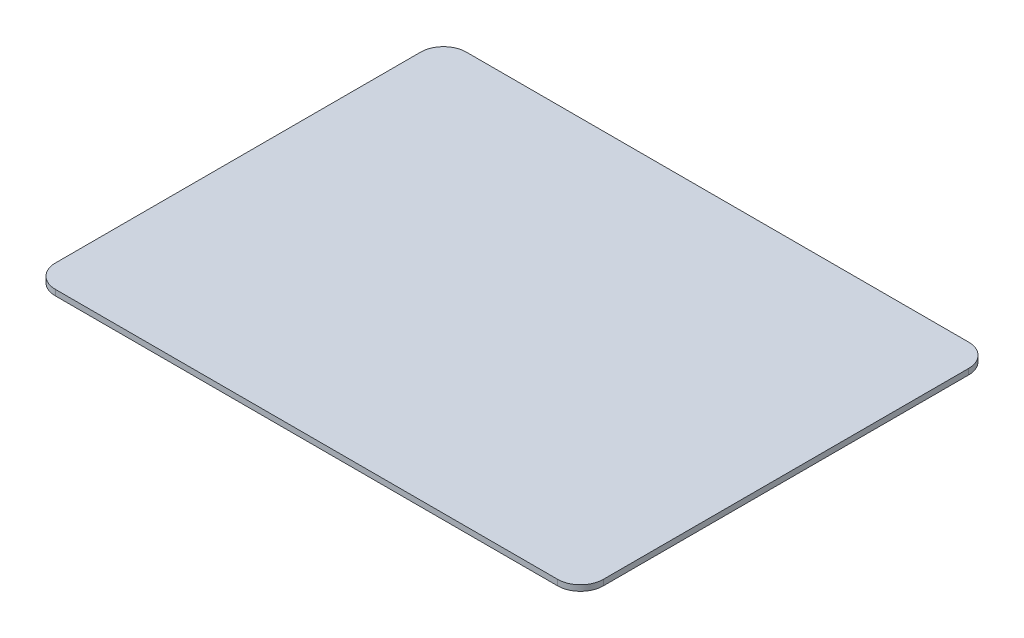
ISO-10303-21;
HEADER;
FILE_DESCRIPTION(('STEP AP214'),'2;1');
FILE_NAME('part.step','',(''),(''),'','','');
FILE_SCHEMA(('AUTOMOTIVE_DESIGN { 1 0 10303 214 1 1 1 1 }'));
ENDSEC;
DATA;
#1=APPLICATION_CONTEXT('core data for automotive mechanical design processes');
#2=APPLICATION_PROTOCOL_DEFINITION('international standard','automotive_design',2000,#1);
#3=PRODUCT_CONTEXT('',#1,'mechanical');
#4=PRODUCT('Part','Part','',(#3));
#5=PRODUCT_RELATED_PRODUCT_CATEGORY('part','',(#4));
#6=PRODUCT_DEFINITION_FORMATION('','',#4);
#7=PRODUCT_DEFINITION_CONTEXT('part definition',#1,'design');
#8=PRODUCT_DEFINITION('design','',#6,#7);
#9=PRODUCT_DEFINITION_SHAPE('','',#8);
#10=(LENGTH_UNIT() NAMED_UNIT(*) SI_UNIT(.MILLI.,.METRE.));
#11=(NAMED_UNIT(*) PLANE_ANGLE_UNIT() SI_UNIT($,.RADIAN.));
#12=(NAMED_UNIT(*) SI_UNIT($,.STERADIAN.) SOLID_ANGLE_UNIT());
#13=UNCERTAINTY_MEASURE_WITH_UNIT(LENGTH_MEASURE(1.E-05),#10,'distance_accuracy_value','');
#14=(GEOMETRIC_REPRESENTATION_CONTEXT(3) GLOBAL_UNCERTAINTY_ASSIGNED_CONTEXT((#13)) GLOBAL_UNIT_ASSIGNED_CONTEXT((#10,
#11,#12)) REPRESENTATION_CONTEXT('',''));
#15=CARTESIAN_POINT('',(0.,0.,0.));
#16=DIRECTION('',(0.,0.,1.));
#17=DIRECTION('',(1.,0.,0.));
#18=AXIS2_PLACEMENT_3D('',#15,#16,#17);
#19=CARTESIAN_POINT('',(139.7,3.175,-101.6));
#20=DIRECTION('',(0.,-1.,0.));
#21=DIRECTION('',(0.,0.,-1.));
#22=AXIS2_PLACEMENT_3D('',#19,#20,#21);
#23=CYLINDRICAL_SURFACE('',#22,12.7);
#24=CARTESIAN_POINT('',(139.7,0.,-101.6));
#25=DIRECTION('',(0.,1.,0.));
#26=DIRECTION('',(0.,0.,1.));
#27=AXIS2_PLACEMENT_3D('',#24,#25,#26);
#28=CIRCLE('',#27,12.7);
#29=CARTESIAN_POINT('',(152.4,0.,-101.6));
#30=VERTEX_POINT('',#29);
#31=CARTESIAN_POINT('',(139.7,0.,-114.3));
#32=VERTEX_POINT('',#31);
#33=EDGE_CURVE('E199',#30,#32,#28,.T.);
#34=ORIENTED_EDGE('',*,*,#33,.T.);
#35=DIRECTION('',(0.,-1.,0.));
#36=VECTOR('',#35,1.);
#37=CARTESIAN_POINT('',(139.7,3.175,-114.3));
#38=LINE('',#37,#36);
#39=CARTESIAN_POINT('',(139.7,3.175,-114.3));
#40=VERTEX_POINT('',#39);
#41=EDGE_CURVE('E12',#40,#32,#38,.T.);
#42=ORIENTED_EDGE('',*,*,#41,.F.);
#43=CARTESIAN_POINT('',(139.7,3.175,-101.6));
#44=DIRECTION('',(0.,1.,0.));
#45=DIRECTION('',(0.,0.,1.));
#46=AXIS2_PLACEMENT_3D('',#43,#44,#45);
#47=CIRCLE('',#46,12.7);
#48=CARTESIAN_POINT('',(152.4,3.175,-101.6));
#49=VERTEX_POINT('',#48);
#50=EDGE_CURVE('E164',#49,#40,#47,.T.);
#51=ORIENTED_EDGE('',*,*,#50,.F.);
#52=DIRECTION('',(0.,-1.,0.));
#53=VECTOR('',#52,1.);
#54=CARTESIAN_POINT('',(152.4,3.175,-101.6));
#55=LINE('',#54,#53);
#56=EDGE_CURVE('E139',#49,#30,#55,.T.);
#57=ORIENTED_EDGE('',*,*,#56,.T.);
#58=EDGE_LOOP('',(#34,#42,#51,#57));
#59=FACE_BOUND('',#58,.T.);
#60=ADVANCED_FACE('F44',(#59),#23,.T.);
#61=CARTESIAN_POINT('',(-139.7,3.175,-114.3));
#62=DIRECTION('',(0.,0.,1.));
#63=DIRECTION('',(1.,0.,0.));
#64=AXIS2_PLACEMENT_3D('',#61,#62,#63);
#65=PLANE('',#64);
#66=DIRECTION('',(-1.,0.,0.));
#67=VECTOR('',#66,1.);
#68=CARTESIAN_POINT('',(-139.7,0.,-114.3));
#69=LINE('',#68,#67);
#70=CARTESIAN_POINT('',(-139.7,0.,-114.3));
#71=VERTEX_POINT('',#70);
#72=EDGE_CURVE('E193',#32,#71,#69,.T.);
#73=ORIENTED_EDGE('',*,*,#72,.T.);
#74=DIRECTION('',(0.,-1.,0.));
#75=VECTOR('',#74,1.);
#76=CARTESIAN_POINT('',(-139.7,3.175,-114.3));
#77=LINE('',#76,#75);
#78=CARTESIAN_POINT('',(-139.7,3.175,-114.3));
#79=VERTEX_POINT('',#78);
#80=EDGE_CURVE('E52',#79,#71,#77,.T.);
#81=ORIENTED_EDGE('',*,*,#80,.F.);
#82=DIRECTION('',(-1.,0.,0.));
#83=VECTOR('',#82,1.);
#84=CARTESIAN_POINT('',(-139.7,3.175,-114.3));
#85=LINE('',#84,#83);
#86=EDGE_CURVE('E103',#40,#79,#85,.T.);
#87=ORIENTED_EDGE('',*,*,#86,.F.);
#88=ORIENTED_EDGE('',*,*,#41,.T.);
#89=EDGE_LOOP('',(#73,#81,#87,#88));
#90=FACE_BOUND('',#89,.T.);
#91=ADVANCED_FACE('F219',(#90),#65,.F.);
#92=CARTESIAN_POINT('',(-139.7,3.175,-101.6));
#93=DIRECTION('',(0.,-1.,0.));
#94=DIRECTION('',(0.,0.,-1.));
#95=AXIS2_PLACEMENT_3D('',#92,#93,#94);
#96=CYLINDRICAL_SURFACE('',#95,12.7);
#97=CARTESIAN_POINT('',(-139.7,0.,-101.6));
#98=DIRECTION('',(0.,1.,0.));
#99=DIRECTION('',(0.,0.,-1.));
#100=AXIS2_PLACEMENT_3D('',#97,#98,#99);
#101=CIRCLE('',#100,12.7);
#102=CARTESIAN_POINT('',(-152.4,0.,-101.6));
#103=VERTEX_POINT('',#102);
#104=EDGE_CURVE('E188',#71,#103,#101,.T.);
#105=ORIENTED_EDGE('',*,*,#104,.T.);
#106=DIRECTION('',(0.,-1.,0.));
#107=VECTOR('',#106,1.);
#108=CARTESIAN_POINT('',(-152.4,3.175,-101.6));
#109=LINE('',#108,#107);
#110=CARTESIAN_POINT('',(-152.4,3.175,-101.6));
#111=VERTEX_POINT('',#110);
#112=EDGE_CURVE('E180',#111,#103,#109,.T.);
#113=ORIENTED_EDGE('',*,*,#112,.F.);
#114=CARTESIAN_POINT('',(-139.7,3.175,-101.6));
#115=DIRECTION('',(0.,1.,0.));
#116=DIRECTION('',(0.,0.,-1.));
#117=AXIS2_PLACEMENT_3D('',#114,#115,#116);
#118=CIRCLE('',#117,12.7);
#119=EDGE_CURVE('E156',#79,#111,#118,.T.);
#120=ORIENTED_EDGE('',*,*,#119,.F.);
#121=ORIENTED_EDGE('',*,*,#80,.T.);
#122=EDGE_LOOP('',(#105,#113,#120,#121));
#123=FACE_BOUND('',#122,.T.);
#124=ADVANCED_FACE('F186',(#123),#96,.T.);
#125=CARTESIAN_POINT('',(-152.4,3.175,101.6));
#126=DIRECTION('',(1.,0.,0.));
#127=DIRECTION('',(0.,0.,-1.));
#128=AXIS2_PLACEMENT_3D('',#125,#126,#127);
#129=PLANE('',#128);
#130=DIRECTION('',(0.,0.,1.));
#131=VECTOR('',#130,1.);
#132=CARTESIAN_POINT('',(-152.4,0.,101.6));
#133=LINE('',#132,#131);
#134=CARTESIAN_POINT('',(-152.4,0.,101.6));
#135=VERTEX_POINT('',#134);
#136=EDGE_CURVE('E195',#103,#135,#133,.T.);
#137=ORIENTED_EDGE('',*,*,#136,.T.);
#138=DIRECTION('',(0.,-1.,0.));
#139=VECTOR('',#138,1.);
#140=CARTESIAN_POINT('',(-152.4,3.175,101.6));
#141=LINE('',#140,#139);
#142=CARTESIAN_POINT('',(-152.4,3.175,101.6));
#143=VERTEX_POINT('',#142);
#144=EDGE_CURVE('E177',#143,#135,#141,.T.);
#145=ORIENTED_EDGE('',*,*,#144,.F.);
#146=DIRECTION('',(0.,0.,1.));
#147=VECTOR('',#146,1.);
#148=CARTESIAN_POINT('',(-152.4,3.175,101.6));
#149=LINE('',#148,#147);
#150=EDGE_CURVE('E152',#111,#143,#149,.T.);
#151=ORIENTED_EDGE('',*,*,#150,.F.);
#152=ORIENTED_EDGE('',*,*,#112,.T.);
#153=EDGE_LOOP('',(#137,#145,#151,#152));
#154=FACE_BOUND('',#153,.T.);
#155=ADVANCED_FACE('F226',(#154),#129,.F.);
#156=CARTESIAN_POINT('',(-139.7,3.175,101.6));
#157=DIRECTION('',(0.,-1.,0.));
#158=DIRECTION('',(0.,0.,-1.));
#159=AXIS2_PLACEMENT_3D('',#156,#157,#158);
#160=CYLINDRICAL_SURFACE('',#159,12.7);
#161=CARTESIAN_POINT('',(-139.7,0.,101.6));
#162=DIRECTION('',(0.,1.,0.));
#163=DIRECTION('',(0.,0.,1.));
#164=AXIS2_PLACEMENT_3D('',#161,#162,#163);
#165=CIRCLE('',#164,12.7);
#166=CARTESIAN_POINT('',(-139.7,0.,114.3));
#167=VERTEX_POINT('',#166);
#168=EDGE_CURVE('E197',#135,#167,#165,.T.);
#169=ORIENTED_EDGE('',*,*,#168,.T.);
#170=DIRECTION('',(0.,-1.,0.));
#171=VECTOR('',#170,1.);
#172=CARTESIAN_POINT('',(-139.7,3.175,114.3));
#173=LINE('',#172,#171);
#174=CARTESIAN_POINT('',(-139.7,3.175,114.3));
#175=VERTEX_POINT('',#174);
#176=EDGE_CURVE('E132',#175,#167,#173,.T.);
#177=ORIENTED_EDGE('',*,*,#176,.F.);
#178=CARTESIAN_POINT('',(-139.7,3.175,101.6));
#179=DIRECTION('',(0.,1.,0.));
#180=DIRECTION('',(0.,0.,1.));
#181=AXIS2_PLACEMENT_3D('',#178,#179,#180);
#182=CIRCLE('',#181,12.7);
#183=EDGE_CURVE('E122',#143,#175,#182,.T.);
#184=ORIENTED_EDGE('',*,*,#183,.F.);
#185=ORIENTED_EDGE('',*,*,#144,.T.);
#186=EDGE_LOOP('',(#169,#177,#184,#185));
#187=FACE_BOUND('',#186,.T.);
#188=ADVANCED_FACE('F203',(#187),#160,.T.);
#189=CARTESIAN_POINT('',(-139.7,3.175,114.3));
#190=DIRECTION('',(0.,0.,-1.));
#191=DIRECTION('',(-1.,0.,0.));
#192=AXIS2_PLACEMENT_3D('',#189,#190,#191);
#193=PLANE('',#192);
#194=DIRECTION('',(1.,0.,0.));
#195=VECTOR('',#194,1.);
#196=CARTESIAN_POINT('',(-139.7,0.,114.3));
#197=LINE('',#196,#195);
#198=CARTESIAN_POINT('',(139.7,0.,114.3));
#199=VERTEX_POINT('',#198);
#200=EDGE_CURVE('E131',#167,#199,#197,.T.);
#201=ORIENTED_EDGE('',*,*,#200,.T.);
#202=DIRECTION('',(0.,-1.,0.));
#203=VECTOR('',#202,1.);
#204=CARTESIAN_POINT('',(139.7,3.175,114.3));
#205=LINE('',#204,#203);
#206=CARTESIAN_POINT('',(139.7,3.175,114.3));
#207=VERTEX_POINT('',#206);
#208=EDGE_CURVE('E128',#207,#199,#205,.T.);
#209=ORIENTED_EDGE('',*,*,#208,.F.);
#210=DIRECTION('',(1.,0.,0.));
#211=VECTOR('',#210,1.);
#212=CARTESIAN_POINT('',(-139.7,3.175,114.3));
#213=LINE('',#212,#211);
#214=EDGE_CURVE('E116',#175,#207,#213,.T.);
#215=ORIENTED_EDGE('',*,*,#214,.F.);
#216=ORIENTED_EDGE('',*,*,#176,.T.);
#217=EDGE_LOOP('',(#201,#209,#215,#216));
#218=FACE_BOUND('',#217,.T.);
#219=ADVANCED_FACE('F129',(#218),#193,.F.);
#220=CARTESIAN_POINT('',(139.7,3.175,101.6));
#221=DIRECTION('',(0.,-1.,0.));
#222=DIRECTION('',(0.,0.,-1.));
#223=AXIS2_PLACEMENT_3D('',#220,#221,#222);
#224=CYLINDRICAL_SURFACE('',#223,12.7);
#225=CARTESIAN_POINT('',(139.7,0.,101.6));
#226=DIRECTION('',(0.,1.,0.));
#227=DIRECTION('',(0.,0.,1.));
#228=AXIS2_PLACEMENT_3D('',#225,#226,#227);
#229=CIRCLE('',#228,12.7);
#230=CARTESIAN_POINT('',(152.4,0.,101.6));
#231=VERTEX_POINT('',#230);
#232=EDGE_CURVE('E89',#199,#231,#229,.T.);
#233=ORIENTED_EDGE('',*,*,#232,.T.);
#234=DIRECTION('',(0.,-1.,0.));
#235=VECTOR('',#234,1.);
#236=CARTESIAN_POINT('',(152.4,3.175,101.6));
#237=LINE('',#236,#235);
#238=CARTESIAN_POINT('',(152.4,3.175,101.6));
#239=VERTEX_POINT('',#238);
#240=EDGE_CURVE('E133',#239,#231,#237,.T.);
#241=ORIENTED_EDGE('',*,*,#240,.F.);
#242=CARTESIAN_POINT('',(139.7,3.175,101.6));
#243=DIRECTION('',(0.,1.,0.));
#244=DIRECTION('',(0.,0.,1.));
#245=AXIS2_PLACEMENT_3D('',#242,#243,#244);
#246=CIRCLE('',#245,12.7);
#247=EDGE_CURVE('E120',#207,#239,#246,.T.);
#248=ORIENTED_EDGE('',*,*,#247,.F.);
#249=ORIENTED_EDGE('',*,*,#208,.T.);
#250=EDGE_LOOP('',(#233,#241,#248,#249));
#251=FACE_BOUND('',#250,.T.);
#252=ADVANCED_FACE('F135',(#251),#224,.T.);
#253=CARTESIAN_POINT('',(152.4,3.175,101.6));
#254=DIRECTION('',(-1.,0.,0.));
#255=DIRECTION('',(0.,0.,1.));
#256=AXIS2_PLACEMENT_3D('',#253,#254,#255);
#257=PLANE('',#256);
#258=DIRECTION('',(0.,0.,-1.));
#259=VECTOR('',#258,1.);
#260=CARTESIAN_POINT('',(152.4,0.,101.6));
#261=LINE('',#260,#259);
#262=EDGE_CURVE('E95',#231,#30,#261,.T.);
#263=ORIENTED_EDGE('',*,*,#262,.T.);
#264=ORIENTED_EDGE('',*,*,#56,.F.);
#265=DIRECTION('',(0.,0.,-1.));
#266=VECTOR('',#265,1.);
#267=CARTESIAN_POINT('',(152.4,3.175,101.6));
#268=LINE('',#267,#266);
#269=EDGE_CURVE('E60',#239,#49,#268,.T.);
#270=ORIENTED_EDGE('',*,*,#269,.F.);
#271=ORIENTED_EDGE('',*,*,#240,.T.);
#272=EDGE_LOOP('',(#263,#264,#270,#271));
#273=FACE_BOUND('',#272,.T.);
#274=ADVANCED_FACE('F207',(#273),#257,.F.);
#275=CARTESIAN_POINT('',(139.7,3.175,-101.6));
#276=DIRECTION('',(0.,1.,0.));
#277=DIRECTION('',(0.,0.,1.));
#278=AXIS2_PLACEMENT_3D('',#275,#276,#277);
#279=PLANE('',#278);
#280=ORIENTED_EDGE('',*,*,#50,.T.);
#281=ORIENTED_EDGE('',*,*,#86,.T.);
#282=ORIENTED_EDGE('',*,*,#119,.T.);
#283=ORIENTED_EDGE('',*,*,#150,.T.);
#284=ORIENTED_EDGE('',*,*,#183,.T.);
#285=ORIENTED_EDGE('',*,*,#214,.T.);
#286=ORIENTED_EDGE('',*,*,#247,.T.);
#287=ORIENTED_EDGE('',*,*,#269,.T.);
#288=EDGE_LOOP('',(#280,#281,#282,#283,#284,#285,#286,#287));
#289=FACE_BOUND('',#288,.T.);
#290=ADVANCED_FACE('F118',(#289),#279,.T.);
#291=CARTESIAN_POINT('',(139.7,0.,-101.6));
#292=DIRECTION('',(0.,1.,0.));
#293=DIRECTION('',(0.,0.,1.));
#294=AXIS2_PLACEMENT_3D('',#291,#292,#293);
#295=PLANE('',#294);
#296=ORIENTED_EDGE('',*,*,#33,.F.);
#297=ORIENTED_EDGE('',*,*,#262,.F.);
#298=ORIENTED_EDGE('',*,*,#232,.F.);
#299=ORIENTED_EDGE('',*,*,#200,.F.);
#300=ORIENTED_EDGE('',*,*,#168,.F.);
#301=ORIENTED_EDGE('',*,*,#136,.F.);
#302=ORIENTED_EDGE('',*,*,#104,.F.);
#303=ORIENTED_EDGE('',*,*,#72,.F.);
#304=EDGE_LOOP('',(#296,#297,#298,#299,#300,#301,#302,#303));
#305=FACE_BOUND('',#304,.T.);
#306=ADVANCED_FACE('F192',(#305),#295,.F.);
#307=CLOSED_SHELL('',(#60,#91,#124,#155,#188,#219,#252,#274,#290,#306));
#308=MANIFOLD_SOLID_BREP('B2',#307);
#309=ADVANCED_BREP_SHAPE_REPRESENTATION('',(#18,#308),#14);
#310=SHAPE_DEFINITION_REPRESENTATION(#9,#309);
ENDSEC;
END-ISO-10303-21;
